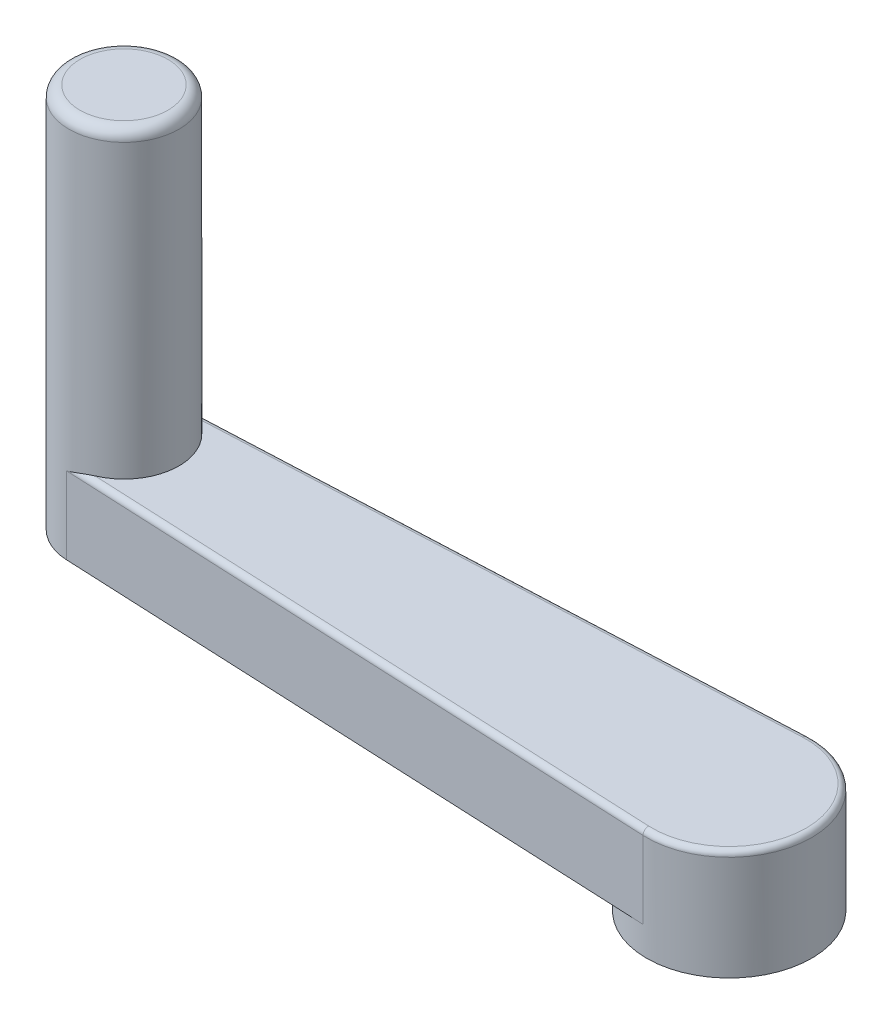
ISO-10303-21;
HEADER;
FILE_DESCRIPTION(('STEP AP214'),'2;1');
FILE_NAME('part.step','',(''),(''),'','','');
FILE_SCHEMA(('AUTOMOTIVE_DESIGN { 1 0 10303 214 1 1 1 1 }'));
ENDSEC;
DATA;
#1=APPLICATION_CONTEXT('core data for automotive mechanical design processes');
#2=APPLICATION_PROTOCOL_DEFINITION('international standard','automotive_design',2000,#1);
#3=PRODUCT_CONTEXT('',#1,'mechanical');
#4=PRODUCT('Part','Part','',(#3));
#5=PRODUCT_RELATED_PRODUCT_CATEGORY('part','',(#4));
#6=PRODUCT_DEFINITION_FORMATION('','',#4);
#7=PRODUCT_DEFINITION_CONTEXT('part definition',#1,'design');
#8=PRODUCT_DEFINITION('design','',#6,#7);
#9=PRODUCT_DEFINITION_SHAPE('','',#8);
#10=(LENGTH_UNIT() NAMED_UNIT(*) SI_UNIT(.MILLI.,.METRE.));
#11=(NAMED_UNIT(*) PLANE_ANGLE_UNIT() SI_UNIT($,.RADIAN.));
#12=(NAMED_UNIT(*) SI_UNIT($,.STERADIAN.) SOLID_ANGLE_UNIT());
#13=UNCERTAINTY_MEASURE_WITH_UNIT(LENGTH_MEASURE(1.E-05),#10,'distance_accuracy_value','');
#14=(GEOMETRIC_REPRESENTATION_CONTEXT(3) GLOBAL_UNCERTAINTY_ASSIGNED_CONTEXT((#13)) GLOBAL_UNIT_ASSIGNED_CONTEXT((#10,
#11,#12)) REPRESENTATION_CONTEXT('',''));
#15=CARTESIAN_POINT('',(0.,0.,0.));
#16=DIRECTION('',(0.,0.,1.));
#17=DIRECTION('',(1.,0.,0.));
#18=AXIS2_PLACEMENT_3D('',#15,#16,#17);
#19=CARTESIAN_POINT('',(-55.,7.5,0.));
#20=DIRECTION('',(0.,-1.,0.));
#21=DIRECTION('',(0.,0.,-1.));
#22=AXIS2_PLACEMENT_3D('',#19,#20,#21);
#23=CYLINDRICAL_SURFACE('',#22,5.);
#24=CARTESIAN_POINT('',(-55.,34.,0.));
#25=DIRECTION('',(0.,1.,0.));
#26=DIRECTION('',(0.,0.,1.));
#27=AXIS2_PLACEMENT_3D('',#24,#25,#26);
#28=CIRCLE('',#27,5.);
#29=CARTESIAN_POINT('',(-55.,34.,5.00000000000001));
#30=VERTEX_POINT('',#29);
#31=EDGE_CURVE('E149',#30,#30,#28,.F.);
#32=ORIENTED_EDGE('',*,*,#31,.T.);
#33=EDGE_LOOP('',(#32));
#34=FACE_BOUND('',#33,.T.);
#35=CARTESIAN_POINT('',(-55.,0.,0.));
#36=DIRECTION('',(0.,1.,0.));
#37=DIRECTION('',(0.,0.,1.));
#38=AXIS2_PLACEMENT_3D('',#35,#36,#37);
#39=CIRCLE('',#38,5.);
#40=CARTESIAN_POINT('',(-55.2272727272727,0.,-4.9948320399627));
#41=VERTEX_POINT('',#40);
#42=CARTESIAN_POINT('',(-55.2272727272727,0.,4.99483203996271));
#43=VERTEX_POINT('',#42);
#44=EDGE_CURVE('E131',#41,#43,#39,.T.);
#45=ORIENTED_EDGE('',*,*,#44,.T.);
#46=DIRECTION('',(0.,-1.,0.));
#47=VECTOR('',#46,1.);
#48=CARTESIAN_POINT('',(-55.2272727272727,7.5,4.99483203996271));
#49=LINE('',#48,#47);
#50=CARTESIAN_POINT('',(-55.2272727272727,7.,4.99483203996271));
#51=VERTEX_POINT('',#50);
#52=EDGE_CURVE('E114',#51,#43,#49,.T.);
#53=ORIENTED_EDGE('',*,*,#52,.F.);
#54=CARTESIAN_POINT('',(-53.0273486443298,7.5,4.59441472104691));
#55=CARTESIAN_POINT('',(-53.0642710727817,7.49999327962232,4.61026838626881));
#56=CARTESIAN_POINT('',(-53.1013729471234,7.49908054021878,4.62567050101831));
#57=CARTESIAN_POINT('',(-53.1758586049069,7.49566198171522,4.655546826699));
#58=CARTESIAN_POINT('',(-53.2132422596105,7.49315685114575,4.67002143569618));
#59=CARTESIAN_POINT('',(-53.3255932776337,7.48359292739792,4.71197878345045));
#60=CARTESIAN_POINT('',(-53.4009140892992,7.47448375367544,4.73806083177618));
#61=CARTESIAN_POINT('',(-53.5518080629558,7.45212053715675,4.78633404603809));
#62=CARTESIAN_POINT('',(-53.6273789583191,7.43888347525495,4.80854058127539));
#63=CARTESIAN_POINT('',(-53.7789243469885,7.40917436021614,4.84924060589603));
#64=CARTESIAN_POINT('',(-53.8548990678049,7.39270024041275,4.8677317078648));
#65=CARTESIAN_POINT('',(-54.0376078793042,7.35014280672324,4.9077196266933));
#66=CARTESIAN_POINT('',(-54.1444526371781,7.32285610072708,4.92744559355877));
#67=CARTESIAN_POINT('',(-54.3583200717625,7.26494561089527,4.9598346418405));
#68=CARTESIAN_POINT('',(-54.4653428160648,7.2343198795526,4.97249357473867));
#69=CARTESIAN_POINT('',(-54.7864115516234,7.13930676728607,5.00005083608887));
#70=CARTESIAN_POINT('',(-55.0005678206638,7.07175527450701,5.0045533102903));
#71=CARTESIAN_POINT('',(-55.2182925418055,7.00284261505865,4.99523458157299));
#72=CARTESIAN_POINT('',(-55.2227828440554,7.00142127418795,4.99503633205677));
#73=CARTESIAN_POINT('',(-55.2272727272726,7.,4.99483203996272));
#74=B_SPLINE_CURVE_WITH_KNOTS('',3,(#54,#55,#56,#57,#58,#59,#60,#61,#62,#63,#64,#65,#66,#67,#68,
#69,#70,#71,#72,#73),.UNSPECIFIED.,.F.,.F.,(4,2,2,2,2,2,2,2,2,4),(0.,0.120512474070221,
0.24097287542554,0.481394661507978,0.720840188453318,0.960439086574272,1.2961729278204,
1.63210364618652,2.30362015702412,2.31776230433713),.UNSPECIFIED.);
#75=CARTESIAN_POINT('',(-53.0273486443298,7.5,4.59441472104692));
#76=VERTEX_POINT('',#75);
#77=EDGE_CURVE('E58',#51,#76,#74,.F.);
#78=ORIENTED_EDGE('',*,*,#77,.T.);
#79=CARTESIAN_POINT('',(-55.,7.5,0.));
#80=DIRECTION('',(0.,1.,0.));
#81=DIRECTION('',(0.,0.,1.));
#82=AXIS2_PLACEMENT_3D('',#79,#80,#81);
#83=CIRCLE('',#82,5.);
#84=CARTESIAN_POINT('',(-53.0273486443298,7.5,-4.5944147210469));
#85=VERTEX_POINT('',#84);
#86=EDGE_CURVE('E127',#85,#76,#83,.F.);
#87=ORIENTED_EDGE('',*,*,#86,.F.);
#88=CARTESIAN_POINT('',(-53.0273486443298,7.5,-4.5944147210469));
#89=CARTESIAN_POINT('',(-53.0642710727818,7.49999327962232,-4.61026838626881));
#90=CARTESIAN_POINT('',(-53.1013729471234,7.49908054021878,-4.62567050101833));
#91=CARTESIAN_POINT('',(-53.1758586049071,7.49566198171521,-4.65554682669905));
#92=CARTESIAN_POINT('',(-53.2132422596107,7.49315685114574,-4.67002143569625));
#93=CARTESIAN_POINT('',(-53.325593277634,7.48359292739789,-4.71197878345055));
#94=CARTESIAN_POINT('',(-53.4009140892996,7.4744837536754,-4.73806083177629));
#95=CARTESIAN_POINT('',(-53.5518080629561,7.45212053715669,-4.78633404603818));
#96=CARTESIAN_POINT('',(-53.6273789583193,7.43888347525489,-4.80854058127546));
#97=CARTESIAN_POINT('',(-53.7789243469886,7.40917436021611,-4.84924060589605));
#98=CARTESIAN_POINT('',(-53.854899067805,7.39270024041275,-4.86773170786481));
#99=CARTESIAN_POINT('',(-54.0376078793041,7.35014280672321,-4.90771962669329));
#100=CARTESIAN_POINT('',(-54.1444526371781,7.32285610072696,-4.92744559355876));
#101=CARTESIAN_POINT('',(-54.3583200717625,7.26494561089542,-4.95983464184048));
#102=CARTESIAN_POINT('',(-54.4653428160648,7.2343198795531,-4.97249357473864));
#103=CARTESIAN_POINT('',(-54.786411551623,7.13930676728513,-5.00005083608887));
#104=CARTESIAN_POINT('',(-55.0005678206621,7.07175527450177,-5.00455331029038));
#105=CARTESIAN_POINT('',(-55.2182925418054,7.00284261505844,-4.99523458157298));
#106=CARTESIAN_POINT('',(-55.2227828440553,7.00142127418784,-4.99503633205677));
#107=CARTESIAN_POINT('',(-55.2272727272726,7.,-4.99483203996271));
#108=B_SPLINE_CURVE_WITH_KNOTS('',3,(#88,#89,#90,#91,#92,#93,#94,#95,#96,#97,#98,#99,#100,#101,
#102,#103,#104,#105,#106,#107),.UNSPECIFIED.,.F.,.F.,(4,2,2,2,2,2,2,2,2,4),(0.,
0.120512474070348,0.2409728754258,0.481394661508442,0.72084018845353,0.960439086574265,
1.29617292782036,1.6321036461864,2.3036201570241,2.31776230433713),.UNSPECIFIED.);
#109=CARTESIAN_POINT('',(-55.2272727272727,7.,-4.9948320399627));
#110=VERTEX_POINT('',#109);
#111=EDGE_CURVE('E11',#85,#110,#108,.T.);
#112=ORIENTED_EDGE('',*,*,#111,.T.);
#113=DIRECTION('',(0.,-1.,0.));
#114=VECTOR('',#113,1.);
#115=CARTESIAN_POINT('',(-55.2272727272727,7.5,-4.9948320399627));
#116=LINE('',#115,#114);
#117=EDGE_CURVE('E135',#110,#41,#116,.T.);
#118=ORIENTED_EDGE('',*,*,#117,.T.);
#119=EDGE_LOOP('',(#45,#53,#78,#87,#112,#118));
#120=FACE_BOUND('',#119,.T.);
#121=ADVANCED_FACE('F47',(#34,#120),#23,.T.);
#122=CARTESIAN_POINT('',(-0.34090909090909,7.5,7.49224805994406));
#123=DIRECTION('',(0.0454545454545454,0.,-0.998966407992541));
#124=DIRECTION('',(-0.998966407992542,0.,-0.0454545454545454));
#125=AXIS2_PLACEMENT_3D('',#122,#123,#124);
#126=PLANE('',#125);
#127=DIRECTION('',(0.,-1.,0.));
#128=VECTOR('',#127,1.);
#129=CARTESIAN_POINT('',(-0.34090909090909,7.5,7.49224805994406));
#130=LINE('',#129,#128);
#131=CARTESIAN_POINT('',(-0.34090909090909,7.,7.49224805994406));
#132=VERTEX_POINT('',#131);
#133=CARTESIAN_POINT('',(-0.34090909090909,0.,7.49224805994406));
#134=VERTEX_POINT('',#133);
#135=EDGE_CURVE('E103',#132,#134,#130,.T.);
#136=ORIENTED_EDGE('',*,*,#135,.F.);
#137=DIRECTION('',(0.998966407992542,0.,0.0454545454545454));
#138=VECTOR('',#137,1.);
#139=CARTESIAN_POINT('',(-55.2272727272727,7.,4.99483203996271));
#140=LINE('',#139,#138);
#141=EDGE_CURVE('E72',#132,#51,#140,.F.);
#142=ORIENTED_EDGE('',*,*,#141,.T.);
#143=ORIENTED_EDGE('',*,*,#52,.T.);
#144=DIRECTION('',(0.998966407992542,0.,0.0454545454545454));
#145=VECTOR('',#144,1.);
#146=CARTESIAN_POINT('',(-0.34090909090909,0.,7.49224805994406));
#147=LINE('',#146,#145);
#148=EDGE_CURVE('E121',#43,#134,#147,.T.);
#149=ORIENTED_EDGE('',*,*,#148,.T.);
#150=EDGE_LOOP('',(#136,#142,#143,#149));
#151=FACE_BOUND('',#150,.T.);
#152=ADVANCED_FACE('F129',(#151),#126,.F.);
#153=CARTESIAN_POINT('',(0.,7.5,0.));
#154=DIRECTION('',(0.,-1.,0.));
#155=DIRECTION('',(0.,0.,-1.));
#156=AXIS2_PLACEMENT_3D('',#153,#154,#155);
#157=CYLINDRICAL_SURFACE('',#156,7.5);
#158=DIRECTION('',(0.,-1.,0.));
#159=VECTOR('',#158,1.);
#160=CARTESIAN_POINT('',(-0.340909090909091,7.5,-7.49224805994406));
#161=LINE('',#160,#159);
#162=CARTESIAN_POINT('',(-0.340909090909091,7.,-7.49224805994406));
#163=VERTEX_POINT('',#162);
#164=CARTESIAN_POINT('',(-0.340909090909091,0.,-7.49224805994406));
#165=VERTEX_POINT('',#164);
#166=EDGE_CURVE('E115',#163,#165,#161,.T.);
#167=ORIENTED_EDGE('',*,*,#166,.F.);
#168=CARTESIAN_POINT('',(0.,7.,0.));
#169=DIRECTION('',(0.,1.,0.));
#170=DIRECTION('',(0.,0.,1.));
#171=AXIS2_PLACEMENT_3D('',#168,#169,#170);
#172=CIRCLE('',#171,7.5);
#173=EDGE_CURVE('E111',#163,#132,#172,.F.);
#174=ORIENTED_EDGE('',*,*,#173,.T.);
#175=ORIENTED_EDGE('',*,*,#135,.T.);
#176=CARTESIAN_POINT('',(0.,0.,0.));
#177=DIRECTION('',(0.,1.,0.));
#178=DIRECTION('',(0.,0.,1.));
#179=AXIS2_PLACEMENT_3D('',#176,#177,#178);
#180=CIRCLE('',#179,7.5);
#181=EDGE_CURVE('E108',#165,#134,#180,.T.);
#182=ORIENTED_EDGE('',*,*,#181,.F.);
#183=EDGE_LOOP('',(#167,#174,#175,#182));
#184=FACE_BOUND('',#183,.T.);
#185=CARTESIAN_POINT('',(0.,-2.5,0.));
#186=DIRECTION('',(0.,1.,0.));
#187=DIRECTION('',(0.,0.,1.));
#188=AXIS2_PLACEMENT_3D('',#185,#186,#187);
#189=CIRCLE('',#188,7.5);
#190=CARTESIAN_POINT('',(0.,-2.5,7.5));
#191=VERTEX_POINT('',#190);
#192=EDGE_CURVE('E126',#191,#191,#189,.T.);
#193=ORIENTED_EDGE('',*,*,#192,.T.);
#194=EDGE_LOOP('',(#193));
#195=FACE_BOUND('',#194,.T.);
#196=ADVANCED_FACE('F106',(#184,#195),#157,.T.);
#197=CARTESIAN_POINT('',(-0.340909090909092,7.5,-7.49224805994406));
#198=DIRECTION('',(0.0454545454545455,0.,0.998966407992541));
#199=DIRECTION('',(0.998966407992542,0.,-0.0454545454545456));
#200=AXIS2_PLACEMENT_3D('',#197,#198,#199);
#201=PLANE('',#200);
#202=ORIENTED_EDGE('',*,*,#117,.F.);
#203=DIRECTION('',(-0.998966407992542,0.,0.0454545454545456));
#204=VECTOR('',#203,1.);
#205=CARTESIAN_POINT('',(-0.340909090909091,7.,-7.49224805994406));
#206=LINE('',#205,#204);
#207=EDGE_CURVE('E167',#110,#163,#206,.F.);
#208=ORIENTED_EDGE('',*,*,#207,.T.);
#209=ORIENTED_EDGE('',*,*,#166,.T.);
#210=DIRECTION('',(-0.998966407992542,0.,0.0454545454545456));
#211=VECTOR('',#210,1.);
#212=CARTESIAN_POINT('',(-0.340909090909092,0.,-7.49224805994406));
#213=LINE('',#212,#211);
#214=EDGE_CURVE('E124',#165,#41,#213,.T.);
#215=ORIENTED_EDGE('',*,*,#214,.T.);
#216=EDGE_LOOP('',(#202,#208,#209,#215));
#217=FACE_BOUND('',#216,.T.);
#218=ADVANCED_FACE('F208',(#217),#201,.F.);
#219=CARTESIAN_POINT('',(0.,7.5,0.));
#220=DIRECTION('',(0.,1.,0.));
#221=DIRECTION('',(0.,0.,1.));
#222=AXIS2_PLACEMENT_3D('',#219,#220,#221);
#223=PLANE('',#222);
#224=ORIENTED_EDGE('',*,*,#86,.T.);
#225=DIRECTION('',(0.998966407992542,0.,0.0454545454545454));
#226=VECTOR('',#225,1.);
#227=CARTESIAN_POINT('',(-0.318181818181818,7.5,6.99276485594779));
#228=LINE('',#227,#226);
#229=CARTESIAN_POINT('',(-0.318181818181818,7.5,6.99276485594779));
#230=VERTEX_POINT('',#229);
#231=EDGE_CURVE('E160',#76,#230,#228,.T.);
#232=ORIENTED_EDGE('',*,*,#231,.T.);
#233=CARTESIAN_POINT('',(0.,7.5,0.));
#234=DIRECTION('',(0.,1.,0.));
#235=DIRECTION('',(0.,0.,1.));
#236=AXIS2_PLACEMENT_3D('',#233,#234,#235);
#237=CIRCLE('',#236,7.);
#238=CARTESIAN_POINT('',(-0.318181818181819,7.5,-6.99276485594779));
#239=VERTEX_POINT('',#238);
#240=EDGE_CURVE('E156',#230,#239,#237,.T.);
#241=ORIENTED_EDGE('',*,*,#240,.T.);
#242=DIRECTION('',(-0.998966407992542,0.,0.0454545454545456));
#243=VECTOR('',#242,1.);
#244=CARTESIAN_POINT('',(-55.2045454545455,7.5,-4.49534883596643));
#245=LINE('',#244,#243);
#246=EDGE_CURVE('E153',#239,#85,#245,.T.);
#247=ORIENTED_EDGE('',*,*,#246,.T.);
#248=EDGE_LOOP('',(#224,#232,#241,#247));
#249=FACE_BOUND('',#248,.T.);
#250=ADVANCED_FACE('F246',(#249),#223,.T.);
#251=CARTESIAN_POINT('',(0.,0.,0.));
#252=DIRECTION('',(0.,1.,0.));
#253=DIRECTION('',(0.,0.,1.));
#254=AXIS2_PLACEMENT_3D('',#251,#252,#253);
#255=PLANE('',#254);
#256=ORIENTED_EDGE('',*,*,#148,.F.);
#257=ORIENTED_EDGE('',*,*,#44,.F.);
#258=ORIENTED_EDGE('',*,*,#214,.F.);
#259=ORIENTED_EDGE('',*,*,#181,.T.);
#260=EDGE_LOOP('',(#256,#257,#258,#259));
#261=FACE_BOUND('',#260,.T.);
#262=ADVANCED_FACE('F119',(#261),#255,.F.);
#263=CARTESIAN_POINT('',(0.,-2.5,0.));
#264=DIRECTION('',(0.,1.,0.));
#265=DIRECTION('',(0.,0.,1.));
#266=AXIS2_PLACEMENT_3D('',#263,#264,#265);
#267=PLANE('',#266);
#268=CARTESIAN_POINT('',(0.,-2.5,0.));
#269=DIRECTION('',(0.,-1.,0.));
#270=DIRECTION('',(0.,0.,-1.));
#271=AXIS2_PLACEMENT_3D('',#268,#269,#270);
#272=CIRCLE('',#271,4.);
#273=CARTESIAN_POINT('',(0.,-2.5,-4.));
#274=VERTEX_POINT('',#273);
#275=EDGE_CURVE('E214',#274,#274,#272,.T.);
#276=ORIENTED_EDGE('',*,*,#275,.F.);
#277=EDGE_LOOP('',(#276));
#278=FACE_BOUND('',#277,.T.);
#279=ORIENTED_EDGE('',*,*,#192,.F.);
#280=EDGE_LOOP('',(#279));
#281=FACE_BOUND('',#280,.T.);
#282=ADVANCED_FACE('F233',(#278,#281),#267,.F.);
#283=CARTESIAN_POINT('',(0.,35.,0.));
#284=DIRECTION('',(0.,1.,0.));
#285=DIRECTION('',(0.,0.,1.));
#286=AXIS2_PLACEMENT_3D('',#283,#284,#285);
#287=PLANE('',#286);
#288=CARTESIAN_POINT('',(-55.,35.,0.));
#289=DIRECTION('',(0.,1.,0.));
#290=DIRECTION('',(0.,0.,1.));
#291=AXIS2_PLACEMENT_3D('',#288,#289,#290);
#292=CIRCLE('',#291,4.);
#293=CARTESIAN_POINT('',(-55.,35.,4.00000000000001));
#294=VERTEX_POINT('',#293);
#295=EDGE_CURVE('E145',#294,#294,#292,.T.);
#296=ORIENTED_EDGE('',*,*,#295,.T.);
#297=EDGE_LOOP('',(#296));
#298=FACE_BOUND('',#297,.T.);
#299=ADVANCED_FACE('F235',(#298),#287,.T.);
#300=CARTESIAN_POINT('',(0.,3.5,0.));
#301=DIRECTION('',(0.,-1.,0.));
#302=DIRECTION('',(0.,0.,-1.));
#303=AXIS2_PLACEMENT_3D('',#300,#301,#302);
#304=CYLINDRICAL_SURFACE('',#303,4.);
#305=CARTESIAN_POINT('',(0.,3.5,0.));
#306=DIRECTION('',(0.,-1.,0.));
#307=DIRECTION('',(0.,0.,-1.));
#308=AXIS2_PLACEMENT_3D('',#305,#306,#307);
#309=CIRCLE('',#308,4.);
#310=CARTESIAN_POINT('',(0.,3.5,-4.));
#311=VERTEX_POINT('',#310);
#312=EDGE_CURVE('E218',#311,#311,#309,.T.);
#313=ORIENTED_EDGE('',*,*,#312,.F.);
#314=EDGE_LOOP('',(#313));
#315=FACE_BOUND('',#314,.T.);
#316=ORIENTED_EDGE('',*,*,#275,.T.);
#317=EDGE_LOOP('',(#316));
#318=FACE_BOUND('',#317,.T.);
#319=ADVANCED_FACE('F243',(#315,#318),#304,.F.);
#320=CARTESIAN_POINT('',(0.,3.5,0.));
#321=DIRECTION('',(0.,-1.,0.));
#322=DIRECTION('',(0.,0.,-1.));
#323=AXIS2_PLACEMENT_3D('',#320,#321,#322);
#324=PLANE('',#323);
#325=ORIENTED_EDGE('',*,*,#312,.T.);
#326=EDGE_LOOP('',(#325));
#327=FACE_BOUND('',#326,.T.);
#328=ADVANCED_FACE('F190',(#327),#324,.T.);
#329=CARTESIAN_POINT('',(-55.,34.,0.));
#330=DIRECTION('',(0.,1.,0.));
#331=DIRECTION('',(0.,0.,1.));
#332=AXIS2_PLACEMENT_3D('',#329,#330,#331);
#333=TOROIDAL_SURFACE('',#332,4.,1.);
#334=ORIENTED_EDGE('',*,*,#31,.F.);
#335=EDGE_LOOP('',(#334));
#336=FACE_BOUND('',#335,.T.);
#337=ORIENTED_EDGE('',*,*,#295,.F.);
#338=EDGE_LOOP('',(#337));
#339=FACE_BOUND('',#338,.T.);
#340=ADVANCED_FACE('F186',(#336,#339),#333,.T.);
#341=CARTESIAN_POINT('',(-0.318181818181818,7.,6.99276485594779));
#342=DIRECTION('',(-0.998966407992542,0.,-0.0454545454545454));
#343=DIRECTION('',(-0.0454545454545454,0.,0.998966407992542));
#344=AXIS2_PLACEMENT_3D('',#341,#342,#343);
#345=CYLINDRICAL_SURFACE('',#344,0.5);
#346=ORIENTED_EDGE('',*,*,#77,.F.);
#347=ORIENTED_EDGE('',*,*,#141,.F.);
#348=CARTESIAN_POINT('',(-0.318181818181818,7.,6.99276485594779));
#349=DIRECTION('',(0.998966407992541,0.,0.0454545454545453));
#350=DIRECTION('',(0.0454545454545453,0.,-0.998966407992542));
#351=AXIS2_PLACEMENT_3D('',#348,#349,#350);
#352=CIRCLE('',#351,0.5);
#353=EDGE_CURVE('E52',#230,#132,#352,.T.);
#354=ORIENTED_EDGE('',*,*,#353,.F.);
#355=ORIENTED_EDGE('',*,*,#231,.F.);
#356=EDGE_LOOP('',(#346,#347,#354,#355));
#357=FACE_BOUND('',#356,.T.);
#358=ADVANCED_FACE('F49',(#357),#345,.T.);
#359=CARTESIAN_POINT('',(-0.318181818181819,7.,-6.99276485594779));
#360=DIRECTION('',(0.998966407992542,0.,-0.0454545454545456));
#361=DIRECTION('',(-0.0454545454545456,0.,-0.998966407992542));
#362=AXIS2_PLACEMENT_3D('',#359,#360,#361);
#363=CYLINDRICAL_SURFACE('',#362,0.5);
#364=ORIENTED_EDGE('',*,*,#111,.F.);
#365=ORIENTED_EDGE('',*,*,#246,.F.);
#366=CARTESIAN_POINT('',(-0.318181818181819,7.,-6.99276485594779));
#367=DIRECTION('',(0.998966407992541,0.,-0.0454545454545456));
#368=DIRECTION('',(-0.0454545454545456,0.,-0.998966407992541));
#369=AXIS2_PLACEMENT_3D('',#366,#367,#368);
#370=CIRCLE('',#369,0.5);
#371=EDGE_CURVE('E206',#163,#239,#370,.T.);
#372=ORIENTED_EDGE('',*,*,#371,.F.);
#373=ORIENTED_EDGE('',*,*,#207,.F.);
#374=EDGE_LOOP('',(#364,#365,#372,#373));
#375=FACE_BOUND('',#374,.T.);
#376=ADVANCED_FACE('F194',(#375),#363,.T.);
#377=CARTESIAN_POINT('',(0.,7.,0.));
#378=DIRECTION('',(0.,1.,0.));
#379=DIRECTION('',(0.,0.,1.));
#380=AXIS2_PLACEMENT_3D('',#377,#378,#379);
#381=TOROIDAL_SURFACE('',#380,7.,0.5);
#382=ORIENTED_EDGE('',*,*,#353,.T.);
#383=ORIENTED_EDGE('',*,*,#173,.F.);
#384=ORIENTED_EDGE('',*,*,#371,.T.);
#385=ORIENTED_EDGE('',*,*,#240,.F.);
#386=EDGE_LOOP('',(#382,#383,#384,#385));
#387=FACE_BOUND('',#386,.T.);
#388=ADVANCED_FACE('F192',(#387),#381,.T.);
#389=CLOSED_SHELL('',(#121,#152,#196,#218,#250,#262,#282,#299,#319,#328,#340,#358,#376,#388));
#390=MANIFOLD_SOLID_BREP('B2',#389);
#391=ADVANCED_BREP_SHAPE_REPRESENTATION('',(#18,#390),#14);
#392=SHAPE_DEFINITION_REPRESENTATION(#9,#391);
ENDSEC;
END-ISO-10303-21;
